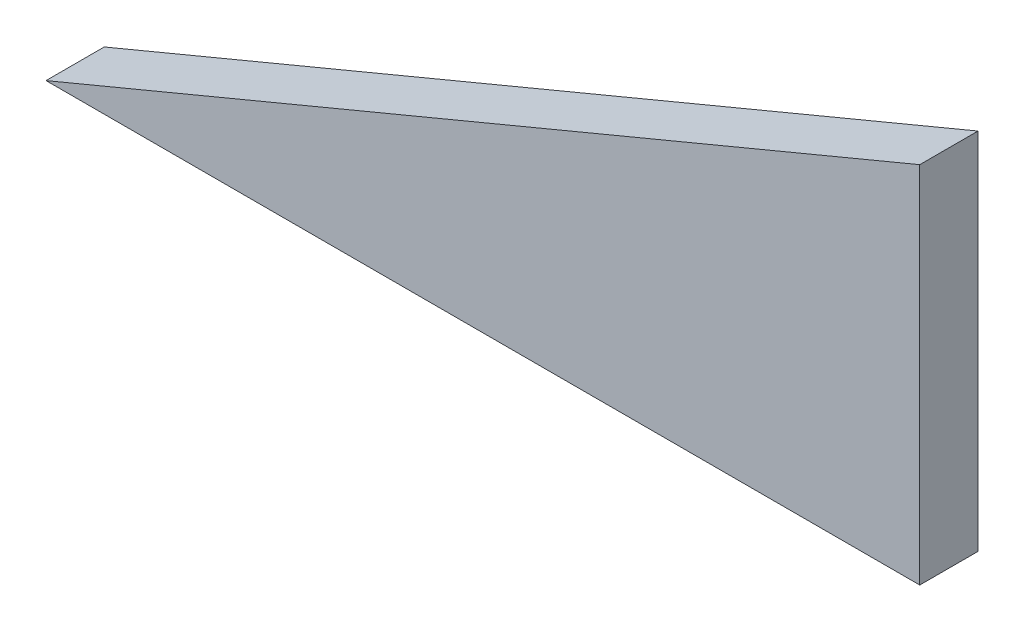
ISO-10303-21;
HEADER;
FILE_DESCRIPTION(('STEP AP214'),'2;1');
FILE_NAME('part.step','',(''),(''),'','','');
FILE_SCHEMA(('AUTOMOTIVE_DESIGN { 1 0 10303 214 1 1 1 1 }'));
ENDSEC;
DATA;
#1=APPLICATION_CONTEXT('core data for automotive mechanical design processes');
#2=APPLICATION_PROTOCOL_DEFINITION('international standard','automotive_design',2000,#1);
#3=PRODUCT_CONTEXT('',#1,'mechanical');
#4=PRODUCT('Part','Part','',(#3));
#5=PRODUCT_RELATED_PRODUCT_CATEGORY('part','',(#4));
#6=PRODUCT_DEFINITION_FORMATION('','',#4);
#7=PRODUCT_DEFINITION_CONTEXT('part definition',#1,'design');
#8=PRODUCT_DEFINITION('design','',#6,#7);
#9=PRODUCT_DEFINITION_SHAPE('','',#8);
#10=(LENGTH_UNIT() NAMED_UNIT(*) SI_UNIT(.MILLI.,.METRE.));
#11=(NAMED_UNIT(*) PLANE_ANGLE_UNIT() SI_UNIT($,.RADIAN.));
#12=(NAMED_UNIT(*) SI_UNIT($,.STERADIAN.) SOLID_ANGLE_UNIT());
#13=UNCERTAINTY_MEASURE_WITH_UNIT(LENGTH_MEASURE(1.E-05),#10,'distance_accuracy_value','');
#14=(GEOMETRIC_REPRESENTATION_CONTEXT(3) GLOBAL_UNCERTAINTY_ASSIGNED_CONTEXT((#13)) GLOBAL_UNIT_ASSIGNED_CONTEXT((#10,
#11,#12)) REPRESENTATION_CONTEXT('',''));
#15=CARTESIAN_POINT('',(0.,0.,0.));
#16=DIRECTION('',(0.,0.,1.));
#17=DIRECTION('',(1.,0.,0.));
#18=AXIS2_PLACEMENT_3D('',#15,#16,#17);
#19=CARTESIAN_POINT('',(-120.,0.,4.));
#20=DIRECTION('',(0.,1.,0.));
#21=DIRECTION('',(0.,0.,1.));
#22=AXIS2_PLACEMENT_3D('',#19,#20,#21);
#23=PLANE('',#22);
#24=DIRECTION('',(1.,0.,0.));
#25=VECTOR('',#24,1.);
#26=CARTESIAN_POINT('',(-120.,0.,-4.));
#27=LINE('',#26,#25);
#28=CARTESIAN_POINT('',(-120.,0.,-4.));
#29=VERTEX_POINT('',#28);
#30=CARTESIAN_POINT('',(0.,0.,-4.));
#31=VERTEX_POINT('',#30);
#32=EDGE_CURVE('E88',#29,#31,#27,.T.);
#33=ORIENTED_EDGE('',*,*,#32,.T.);
#34=DIRECTION('',(0.,0.,-1.));
#35=VECTOR('',#34,1.);
#36=CARTESIAN_POINT('',(0.,0.,4.));
#37=LINE('',#36,#35);
#38=CARTESIAN_POINT('',(0.,0.,4.));
#39=VERTEX_POINT('',#38);
#40=EDGE_CURVE('E11',#39,#31,#37,.T.);
#41=ORIENTED_EDGE('',*,*,#40,.F.);
#42=DIRECTION('',(1.,0.,0.));
#43=VECTOR('',#42,1.);
#44=CARTESIAN_POINT('',(-120.,0.,4.));
#45=LINE('',#44,#43);
#46=CARTESIAN_POINT('',(-120.,0.,4.));
#47=VERTEX_POINT('',#46);
#48=EDGE_CURVE('E81',#47,#39,#45,.T.);
#49=ORIENTED_EDGE('',*,*,#48,.F.);
#50=DIRECTION('',(0.,0.,-1.));
#51=VECTOR('',#50,1.);
#52=CARTESIAN_POINT('',(-120.,0.,4.));
#53=LINE('',#52,#51);
#54=EDGE_CURVE('E89',#47,#29,#53,.T.);
#55=ORIENTED_EDGE('',*,*,#54,.T.);
#56=EDGE_LOOP('',(#33,#41,#49,#55));
#57=FACE_BOUND('',#56,.T.);
#58=ADVANCED_FACE('F41',(#57),#23,.F.);
#59=CARTESIAN_POINT('',(0.,0.,4.));
#60=DIRECTION('',(-1.,0.,0.));
#61=DIRECTION('',(0.,0.,1.));
#62=AXIS2_PLACEMENT_3D('',#59,#60,#61);
#63=PLANE('',#62);
#64=DIRECTION('',(0.,1.,0.));
#65=VECTOR('',#64,1.);
#66=CARTESIAN_POINT('',(0.,0.,-4.));
#67=LINE('',#66,#65);
#68=CARTESIAN_POINT('',(0.,50.,-4.));
#69=VERTEX_POINT('',#68);
#70=EDGE_CURVE('E69',#31,#69,#67,.T.);
#71=ORIENTED_EDGE('',*,*,#70,.T.);
#72=DIRECTION('',(0.,0.,-1.));
#73=VECTOR('',#72,1.);
#74=CARTESIAN_POINT('',(0.,50.,4.));
#75=LINE('',#74,#73);
#76=CARTESIAN_POINT('',(0.,50.,4.));
#77=VERTEX_POINT('',#76);
#78=EDGE_CURVE('E49',#77,#69,#75,.T.);
#79=ORIENTED_EDGE('',*,*,#78,.F.);
#80=DIRECTION('',(0.,1.,0.));
#81=VECTOR('',#80,1.);
#82=CARTESIAN_POINT('',(0.,0.,4.));
#83=LINE('',#82,#81);
#84=EDGE_CURVE('E77',#39,#77,#83,.T.);
#85=ORIENTED_EDGE('',*,*,#84,.F.);
#86=ORIENTED_EDGE('',*,*,#40,.T.);
#87=EDGE_LOOP('',(#71,#79,#85,#86));
#88=FACE_BOUND('',#87,.T.);
#89=ADVANCED_FACE('F78',(#88),#63,.F.);
#90=CARTESIAN_POINT('',(0.,50.,4.));
#91=DIRECTION('',(0.384615384615385,-0.923076923076923,0.));
#92=DIRECTION('',(0.923076923076923,0.384615384615385,0.));
#93=AXIS2_PLACEMENT_3D('',#90,#91,#92);
#94=PLANE('',#93);
#95=DIRECTION('',(-0.923076923076923,-0.384615384615385,0.));
#96=VECTOR('',#95,1.);
#97=CARTESIAN_POINT('',(0.,50.,-4.));
#98=LINE('',#97,#96);
#99=EDGE_CURVE('E74',#69,#29,#98,.T.);
#100=ORIENTED_EDGE('',*,*,#99,.T.);
#101=ORIENTED_EDGE('',*,*,#54,.F.);
#102=DIRECTION('',(-0.923076923076923,-0.384615384615385,0.));
#103=VECTOR('',#102,1.);
#104=CARTESIAN_POINT('',(0.,50.,4.));
#105=LINE('',#104,#103);
#106=EDGE_CURVE('E57',#77,#47,#105,.T.);
#107=ORIENTED_EDGE('',*,*,#106,.F.);
#108=ORIENTED_EDGE('',*,*,#78,.T.);
#109=EDGE_LOOP('',(#100,#101,#107,#108));
#110=FACE_BOUND('',#109,.T.);
#111=ADVANCED_FACE('F96',(#110),#94,.F.);
#112=CARTESIAN_POINT('',(0.,0.,4.));
#113=DIRECTION('',(0.,0.,1.));
#114=DIRECTION('',(1.,0.,0.));
#115=AXIS2_PLACEMENT_3D('',#112,#113,#114);
#116=PLANE('',#115);
#117=ORIENTED_EDGE('',*,*,#48,.T.);
#118=ORIENTED_EDGE('',*,*,#84,.T.);
#119=ORIENTED_EDGE('',*,*,#106,.T.);
#120=EDGE_LOOP('',(#117,#118,#119));
#121=FACE_BOUND('',#120,.T.);
#122=ADVANCED_FACE('F84',(#121),#116,.T.);
#123=CARTESIAN_POINT('',(0.,0.,-4.));
#124=DIRECTION('',(0.,0.,1.));
#125=DIRECTION('',(1.,0.,0.));
#126=AXIS2_PLACEMENT_3D('',#123,#124,#125);
#127=PLANE('',#126);
#128=ORIENTED_EDGE('',*,*,#32,.F.);
#129=ORIENTED_EDGE('',*,*,#99,.F.);
#130=ORIENTED_EDGE('',*,*,#70,.F.);
#131=EDGE_LOOP('',(#128,#129,#130));
#132=FACE_BOUND('',#131,.T.);
#133=ADVANCED_FACE('F97',(#132),#127,.F.);
#134=CLOSED_SHELL('',(#58,#89,#111,#122,#133));
#135=MANIFOLD_SOLID_BREP('B2',#134);
#136=ADVANCED_BREP_SHAPE_REPRESENTATION('',(#18,#135),#14);
#137=SHAPE_DEFINITION_REPRESENTATION(#9,#136);
ENDSEC;
END-ISO-10303-21;
